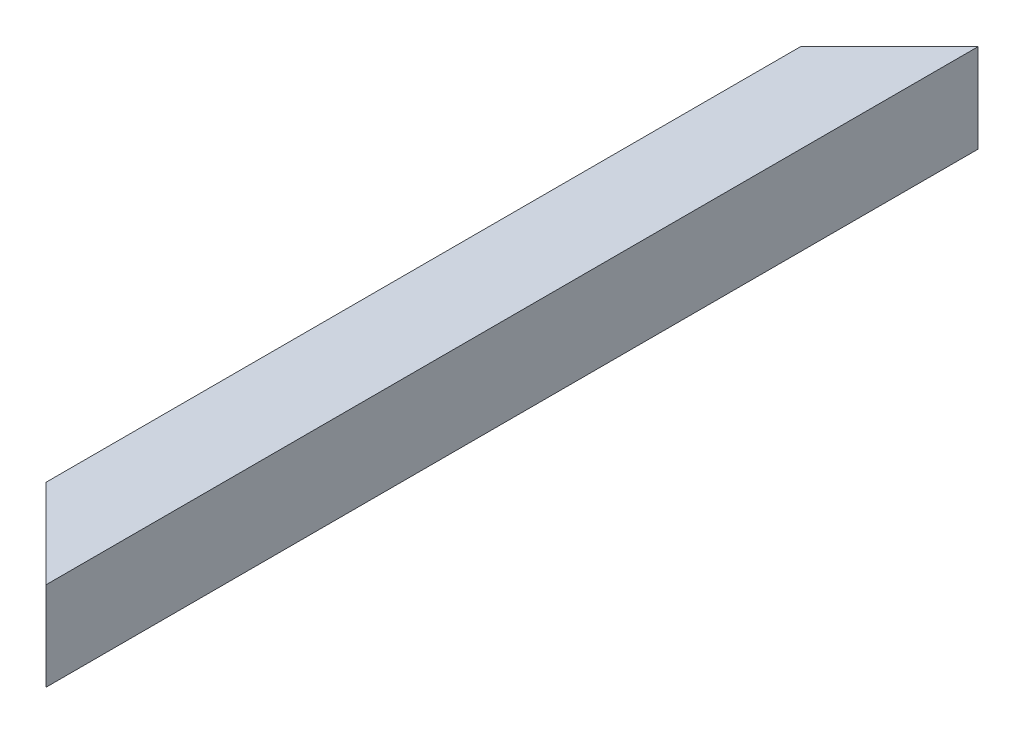
ISO-10303-21;
HEADER;
FILE_DESCRIPTION(('STEP AP214'),'2;1');
FILE_NAME('part.step','',(''),(''),'','','');
FILE_SCHEMA(('AUTOMOTIVE_DESIGN { 1 0 10303 214 1 1 1 1 }'));
ENDSEC;
DATA;
#1=APPLICATION_CONTEXT('core data for automotive mechanical design processes');
#2=APPLICATION_PROTOCOL_DEFINITION('international standard','automotive_design',2000,#1);
#3=PRODUCT_CONTEXT('',#1,'mechanical');
#4=PRODUCT('Part','Part','',(#3));
#5=PRODUCT_RELATED_PRODUCT_CATEGORY('part','',(#4));
#6=PRODUCT_DEFINITION_FORMATION('','',#4);
#7=PRODUCT_DEFINITION_CONTEXT('part definition',#1,'design');
#8=PRODUCT_DEFINITION('design','',#6,#7);
#9=PRODUCT_DEFINITION_SHAPE('','',#8);
#10=(LENGTH_UNIT() NAMED_UNIT(*) SI_UNIT(.MILLI.,.METRE.));
#11=(NAMED_UNIT(*) PLANE_ANGLE_UNIT() SI_UNIT($,.RADIAN.));
#12=(NAMED_UNIT(*) SI_UNIT($,.STERADIAN.) SOLID_ANGLE_UNIT());
#13=UNCERTAINTY_MEASURE_WITH_UNIT(LENGTH_MEASURE(1.E-05),#10,'distance_accuracy_value','');
#14=(GEOMETRIC_REPRESENTATION_CONTEXT(3) GLOBAL_UNCERTAINTY_ASSIGNED_CONTEXT((#13)) GLOBAL_UNIT_ASSIGNED_CONTEXT((#10,
#11,#12)) REPRESENTATION_CONTEXT('',''));
#15=CARTESIAN_POINT('',(0.,0.,0.));
#16=DIRECTION('',(0.,0.,1.));
#17=DIRECTION('',(1.,0.,0.));
#18=AXIS2_PLACEMENT_3D('',#15,#16,#17);
#19=CARTESIAN_POINT('',(8.325,8.325,100.));
#20=DIRECTION('',(1.,0.,0.));
#21=DIRECTION('',(0.,0.,-1.));
#22=AXIS2_PLACEMENT_3D('',#19,#20,#21);
#23=PLANE('',#22);
#24=DIRECTION('',(0.,0.,-1.));
#25=VECTOR('',#24,1.);
#26=CARTESIAN_POINT('',(8.325,8.325,100.));
#27=LINE('',#26,#25);
#28=CARTESIAN_POINT('',(8.325,8.325,98.8));
#29=VERTEX_POINT('',#28);
#30=CARTESIAN_POINT('',(8.325,8.325,-98.8));
#31=VERTEX_POINT('',#30);
#32=EDGE_CURVE('E144',#29,#31,#27,.T.);
#33=ORIENTED_EDGE('',*,*,#32,.T.);
#34=DIRECTION('',(0.,-1.,0.));
#35=VECTOR('',#34,1.);
#36=CARTESIAN_POINT('',(8.325,8.325,-98.8));
#37=LINE('',#36,#35);
#38=CARTESIAN_POINT('',(8.325,-8.325,-98.8));
#39=VERTEX_POINT('',#38);
#40=EDGE_CURVE('E11',#31,#39,#37,.T.);
#41=ORIENTED_EDGE('',*,*,#40,.T.);
#42=DIRECTION('',(0.,0.,-1.));
#43=VECTOR('',#42,1.);
#44=CARTESIAN_POINT('',(8.325,-8.325,100.));
#45=LINE('',#44,#43);
#46=CARTESIAN_POINT('',(8.325,-8.325,98.8));
#47=VERTEX_POINT('',#46);
#48=EDGE_CURVE('E146',#47,#39,#45,.T.);
#49=ORIENTED_EDGE('',*,*,#48,.F.);
#50=DIRECTION('',(0.,1.,0.));
#51=VECTOR('',#50,1.);
#52=CARTESIAN_POINT('',(8.325,8.325,98.8));
#53=LINE('',#52,#51);
#54=EDGE_CURVE('E48',#47,#29,#53,.T.);
#55=ORIENTED_EDGE('',*,*,#54,.T.);
#56=EDGE_LOOP('',(#33,#41,#49,#55));
#57=FACE_BOUND('',#56,.T.);
#58=ADVANCED_FACE('F39',(#57),#23,.F.);
#59=CARTESIAN_POINT('',(8.325,-8.325,100.));
#60=DIRECTION('',(0.,-1.,0.));
#61=DIRECTION('',(0.,0.,-1.));
#62=AXIS2_PLACEMENT_3D('',#59,#60,#61);
#63=PLANE('',#62);
#64=ORIENTED_EDGE('',*,*,#48,.T.);
#65=DIRECTION('',(-0.707106781186548,0.,0.707106781186547));
#66=VECTOR('',#65,1.);
#67=CARTESIAN_POINT('',(-91.075,-8.325,0.599999999999948));
#68=LINE('',#67,#66);
#69=CARTESIAN_POINT('',(-8.325,-8.325,-82.15));
#70=VERTEX_POINT('',#69);
#71=EDGE_CURVE('E63',#39,#70,#68,.T.);
#72=ORIENTED_EDGE('',*,*,#71,.T.);
#73=DIRECTION('',(0.,0.,-1.));
#74=VECTOR('',#73,1.);
#75=CARTESIAN_POINT('',(-8.325,-8.325,100.));
#76=LINE('',#75,#74);
#77=CARTESIAN_POINT('',(-8.325,-8.325,82.15));
#78=VERTEX_POINT('',#77);
#79=EDGE_CURVE('E158',#78,#70,#76,.T.);
#80=ORIENTED_EDGE('',*,*,#79,.F.);
#81=DIRECTION('',(0.707106781186548,0.,0.707106781186547));
#82=VECTOR('',#81,1.);
#83=CARTESIAN_POINT('',(8.925,-8.325,99.4));
#84=LINE('',#83,#82);
#85=EDGE_CURVE('E115',#78,#47,#84,.T.);
#86=ORIENTED_EDGE('',*,*,#85,.T.);
#87=EDGE_LOOP('',(#64,#72,#80,#86));
#88=FACE_BOUND('',#87,.T.);
#89=ADVANCED_FACE('F209',(#88),#63,.F.);
#90=CARTESIAN_POINT('',(-8.325,-8.325,100.));
#91=DIRECTION('',(-1.,0.,0.));
#92=DIRECTION('',(0.,0.,1.));
#93=AXIS2_PLACEMENT_3D('',#90,#91,#92);
#94=PLANE('',#93);
#95=ORIENTED_EDGE('',*,*,#79,.T.);
#96=DIRECTION('',(0.,1.,0.));
#97=VECTOR('',#96,1.);
#98=CARTESIAN_POINT('',(-8.325,-8.325,-82.15));
#99=LINE('',#98,#97);
#100=CARTESIAN_POINT('',(-8.325,8.325,-82.15));
#101=VERTEX_POINT('',#100);
#102=EDGE_CURVE('E160',#70,#101,#99,.T.);
#103=ORIENTED_EDGE('',*,*,#102,.T.);
#104=DIRECTION('',(0.,0.,-1.));
#105=VECTOR('',#104,1.);
#106=CARTESIAN_POINT('',(-8.325,8.325,100.));
#107=LINE('',#106,#105);
#108=CARTESIAN_POINT('',(-8.325,8.325,82.15));
#109=VERTEX_POINT('',#108);
#110=EDGE_CURVE('E169',#109,#101,#107,.T.);
#111=ORIENTED_EDGE('',*,*,#110,.F.);
#112=DIRECTION('',(0.,-1.,0.));
#113=VECTOR('',#112,1.);
#114=CARTESIAN_POINT('',(-8.325,-8.325,82.15));
#115=LINE('',#114,#113);
#116=EDGE_CURVE('E191',#109,#78,#115,.T.);
#117=ORIENTED_EDGE('',*,*,#116,.T.);
#118=EDGE_LOOP('',(#95,#103,#111,#117));
#119=FACE_BOUND('',#118,.T.);
#120=ADVANCED_FACE('F207',(#119),#94,.F.);
#121=CARTESIAN_POINT('',(-8.325,8.325,100.));
#122=DIRECTION('',(0.,1.,0.));
#123=DIRECTION('',(0.,0.,1.));
#124=AXIS2_PLACEMENT_3D('',#121,#122,#123);
#125=PLANE('',#124);
#126=ORIENTED_EDGE('',*,*,#110,.T.);
#127=DIRECTION('',(0.707106781186548,0.,-0.707106781186547));
#128=VECTOR('',#127,1.);
#129=CARTESIAN_POINT('',(-99.4,8.325,8.92499999999995));
#130=LINE('',#129,#128);
#131=EDGE_CURVE('E153',#101,#31,#130,.T.);
#132=ORIENTED_EDGE('',*,*,#131,.T.);
#133=ORIENTED_EDGE('',*,*,#32,.F.);
#134=DIRECTION('',(-0.707106781186548,0.,-0.707106781186547));
#135=VECTOR('',#134,1.);
#136=CARTESIAN_POINT('',(0.599999999999998,8.325,91.075));
#137=LINE('',#136,#135);
#138=EDGE_CURVE('E55',#29,#109,#137,.T.);
#139=ORIENTED_EDGE('',*,*,#138,.T.);
#140=EDGE_LOOP('',(#126,#132,#133,#139));
#141=FACE_BOUND('',#140,.T.);
#142=ADVANCED_FACE('F151',(#141),#125,.F.);
#143=CARTESIAN_POINT('',(-9.525,-9.525,80.95));
#144=DIRECTION('',(0.707106781186547,0.,-0.707106781186548));
#145=DIRECTION('',(-0.707106781186548,0.,-0.707106781186547));
#146=AXIS2_PLACEMENT_3D('',#143,#144,#145);
#147=PLANE('',#146);
#148=DIRECTION('',(0.,1.,0.));
#149=VECTOR('',#148,1.);
#150=CARTESIAN_POINT('',(-9.525,-9.525,80.95));
#151=LINE('',#150,#149);
#152=CARTESIAN_POINT('',(-9.525,-9.525,80.95));
#153=VERTEX_POINT('',#152);
#154=CARTESIAN_POINT('',(-9.525,9.525,80.95));
#155=VERTEX_POINT('',#154);
#156=EDGE_CURVE('E126',#153,#155,#151,.T.);
#157=ORIENTED_EDGE('',*,*,#156,.F.);
#158=DIRECTION('',(-0.707106781186548,0.,-0.707106781186547));
#159=VECTOR('',#158,1.);
#160=CARTESIAN_POINT('',(-9.525,-9.525,80.95));
#161=LINE('',#160,#159);
#162=CARTESIAN_POINT('',(9.525,-9.525,100.));
#163=VERTEX_POINT('',#162);
#164=EDGE_CURVE('E178',#163,#153,#161,.T.);
#165=ORIENTED_EDGE('',*,*,#164,.F.);
#166=DIRECTION('',(0.,1.,0.));
#167=VECTOR('',#166,1.);
#168=CARTESIAN_POINT('',(9.525,-9.525,100.));
#169=LINE('',#168,#167);
#170=CARTESIAN_POINT('',(9.525,9.525,100.));
#171=VERTEX_POINT('',#170);
#172=EDGE_CURVE('E164',#163,#171,#169,.T.);
#173=ORIENTED_EDGE('',*,*,#172,.T.);
#174=DIRECTION('',(-0.707106781186548,0.,-0.707106781186547));
#175=VECTOR('',#174,1.);
#176=CARTESIAN_POINT('',(-9.525,9.525,80.95));
#177=LINE('',#176,#175);
#178=EDGE_CURVE('E182',#171,#155,#177,.T.);
#179=ORIENTED_EDGE('',*,*,#178,.T.);
#180=EDGE_LOOP('',(#157,#165,#173,#179));
#181=FACE_BOUND('',#180,.T.);
#182=ORIENTED_EDGE('',*,*,#54,.F.);
#183=ORIENTED_EDGE('',*,*,#85,.F.);
#184=ORIENTED_EDGE('',*,*,#116,.F.);
#185=ORIENTED_EDGE('',*,*,#138,.F.);
#186=EDGE_LOOP('',(#182,#183,#184,#185));
#187=FACE_BOUND('',#186,.T.);
#188=ADVANCED_FACE('F210',(#181,#187),#147,.F.);
#189=CARTESIAN_POINT('',(-9.525,-9.525,-80.95));
#190=DIRECTION('',(0.707106781186547,0.,0.707106781186548));
#191=DIRECTION('',(0.707106781186548,0.,-0.707106781186547));
#192=AXIS2_PLACEMENT_3D('',#189,#190,#191);
#193=PLANE('',#192);
#194=DIRECTION('',(0.,1.,0.));
#195=VECTOR('',#194,1.);
#196=CARTESIAN_POINT('',(9.525,-9.525,-100.));
#197=LINE('',#196,#195);
#198=CARTESIAN_POINT('',(9.525,-9.525,-100.));
#199=VERTEX_POINT('',#198);
#200=CARTESIAN_POINT('',(9.525,9.525,-100.));
#201=VERTEX_POINT('',#200);
#202=EDGE_CURVE('E167',#199,#201,#197,.T.);
#203=ORIENTED_EDGE('',*,*,#202,.F.);
#204=DIRECTION('',(0.707106781186548,0.,-0.707106781186547));
#205=VECTOR('',#204,1.);
#206=CARTESIAN_POINT('',(-9.525,-9.525,-80.95));
#207=LINE('',#206,#205);
#208=CARTESIAN_POINT('',(-9.525,-9.525,-80.95));
#209=VERTEX_POINT('',#208);
#210=EDGE_CURVE('E109',#209,#199,#207,.T.);
#211=ORIENTED_EDGE('',*,*,#210,.F.);
#212=DIRECTION('',(0.,1.,0.));
#213=VECTOR('',#212,1.);
#214=CARTESIAN_POINT('',(-9.525,-9.525,-80.95));
#215=LINE('',#214,#213);
#216=CARTESIAN_POINT('',(-9.525,9.525,-80.95));
#217=VERTEX_POINT('',#216);
#218=EDGE_CURVE('E103',#209,#217,#215,.T.);
#219=ORIENTED_EDGE('',*,*,#218,.T.);
#220=DIRECTION('',(0.707106781186548,0.,-0.707106781186547));
#221=VECTOR('',#220,1.);
#222=CARTESIAN_POINT('',(-9.525,9.525,-80.95));
#223=LINE('',#222,#221);
#224=EDGE_CURVE('E106',#217,#201,#223,.T.);
#225=ORIENTED_EDGE('',*,*,#224,.T.);
#226=EDGE_LOOP('',(#203,#211,#219,#225));
#227=FACE_BOUND('',#226,.T.);
#228=ORIENTED_EDGE('',*,*,#102,.F.);
#229=ORIENTED_EDGE('',*,*,#71,.F.);
#230=ORIENTED_EDGE('',*,*,#40,.F.);
#231=ORIENTED_EDGE('',*,*,#131,.F.);
#232=EDGE_LOOP('',(#228,#229,#230,#231));
#233=FACE_BOUND('',#232,.T.);
#234=ADVANCED_FACE('F105',(#227,#233),#193,.F.);
#235=CARTESIAN_POINT('',(9.525,-9.525,100.));
#236=DIRECTION('',(-1.,0.,0.));
#237=DIRECTION('',(0.,0.,1.));
#238=AXIS2_PLACEMENT_3D('',#235,#236,#237);
#239=PLANE('',#238);
#240=ORIENTED_EDGE('',*,*,#202,.T.);
#241=DIRECTION('',(0.,0.,-1.));
#242=VECTOR('',#241,1.);
#243=CARTESIAN_POINT('',(9.525,9.525,100.));
#244=LINE('',#243,#242);
#245=EDGE_CURVE('E123',#171,#201,#244,.T.);
#246=ORIENTED_EDGE('',*,*,#245,.F.);
#247=ORIENTED_EDGE('',*,*,#172,.F.);
#248=DIRECTION('',(0.,0.,-1.));
#249=VECTOR('',#248,1.);
#250=CARTESIAN_POINT('',(9.525,-9.525,100.));
#251=LINE('',#250,#249);
#252=EDGE_CURVE('E136',#163,#199,#251,.T.);
#253=ORIENTED_EDGE('',*,*,#252,.T.);
#254=EDGE_LOOP('',(#240,#246,#247,#253));
#255=FACE_BOUND('',#254,.T.);
#256=ADVANCED_FACE('F41',(#255),#239,.F.);
#257=CARTESIAN_POINT('',(-9.525,9.525,100.));
#258=DIRECTION('',(0.,-1.,0.));
#259=DIRECTION('',(0.,0.,-1.));
#260=AXIS2_PLACEMENT_3D('',#257,#258,#259);
#261=PLANE('',#260);
#262=ORIENTED_EDGE('',*,*,#245,.T.);
#263=ORIENTED_EDGE('',*,*,#224,.F.);
#264=DIRECTION('',(0.,0.,-1.));
#265=VECTOR('',#264,1.);
#266=CARTESIAN_POINT('',(-9.525,9.525,100.));
#267=LINE('',#266,#265);
#268=EDGE_CURVE('E121',#155,#217,#267,.T.);
#269=ORIENTED_EDGE('',*,*,#268,.F.);
#270=ORIENTED_EDGE('',*,*,#178,.F.);
#271=EDGE_LOOP('',(#262,#263,#269,#270));
#272=FACE_BOUND('',#271,.T.);
#273=ADVANCED_FACE('F119',(#272),#261,.F.);
#274=CARTESIAN_POINT('',(-9.525,-9.525,100.));
#275=DIRECTION('',(1.,0.,0.));
#276=DIRECTION('',(0.,0.,-1.));
#277=AXIS2_PLACEMENT_3D('',#274,#275,#276);
#278=PLANE('',#277);
#279=ORIENTED_EDGE('',*,*,#268,.T.);
#280=ORIENTED_EDGE('',*,*,#218,.F.);
#281=DIRECTION('',(0.,0.,-1.));
#282=VECTOR('',#281,1.);
#283=CARTESIAN_POINT('',(-9.525,-9.525,100.));
#284=LINE('',#283,#282);
#285=EDGE_CURVE('E131',#153,#209,#284,.T.);
#286=ORIENTED_EDGE('',*,*,#285,.F.);
#287=ORIENTED_EDGE('',*,*,#156,.T.);
#288=EDGE_LOOP('',(#279,#280,#286,#287));
#289=FACE_BOUND('',#288,.T.);
#290=ADVANCED_FACE('F129',(#289),#278,.F.);
#291=CARTESIAN_POINT('',(-9.525,-9.525,100.));
#292=DIRECTION('',(0.,1.,0.));
#293=DIRECTION('',(0.,0.,1.));
#294=AXIS2_PLACEMENT_3D('',#291,#292,#293);
#295=PLANE('',#294);
#296=ORIENTED_EDGE('',*,*,#285,.T.);
#297=ORIENTED_EDGE('',*,*,#210,.T.);
#298=ORIENTED_EDGE('',*,*,#252,.F.);
#299=ORIENTED_EDGE('',*,*,#164,.T.);
#300=EDGE_LOOP('',(#296,#297,#298,#299));
#301=FACE_BOUND('',#300,.T.);
#302=ADVANCED_FACE('F177',(#301),#295,.F.);
#303=CLOSED_SHELL('',(#58,#89,#120,#142,#188,#234,#256,#273,#290,#302));
#304=MANIFOLD_SOLID_BREP('B2',#303);
#305=ADVANCED_BREP_SHAPE_REPRESENTATION('',(#18,#304),#14);
#306=SHAPE_DEFINITION_REPRESENTATION(#9,#305);
ENDSEC;
END-ISO-10303-21;
